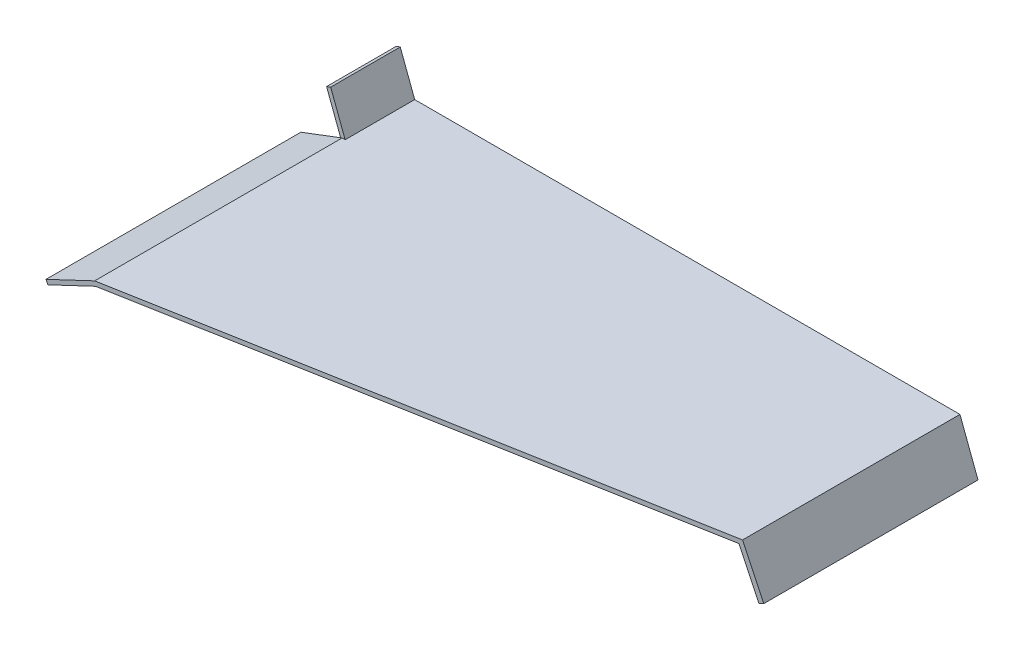
ISO-10303-21;
HEADER;
FILE_DESCRIPTION(('STEP AP214'),'2;1');
FILE_NAME('part.step','',(''),(''),'','','');
FILE_SCHEMA(('AUTOMOTIVE_DESIGN { 1 0 10303 214 1 1 1 1 }'));
ENDSEC;
DATA;
#1=APPLICATION_CONTEXT('core data for automotive mechanical design processes');
#2=APPLICATION_PROTOCOL_DEFINITION('international standard','automotive_design',2000,#1);
#3=PRODUCT_CONTEXT('',#1,'mechanical');
#4=PRODUCT('Part','Part','',(#3));
#5=PRODUCT_RELATED_PRODUCT_CATEGORY('part','',(#4));
#6=PRODUCT_DEFINITION_FORMATION('','',#4);
#7=PRODUCT_DEFINITION_CONTEXT('part definition',#1,'design');
#8=PRODUCT_DEFINITION('design','',#6,#7);
#9=PRODUCT_DEFINITION_SHAPE('','',#8);
#10=(LENGTH_UNIT() NAMED_UNIT(*) SI_UNIT(.MILLI.,.METRE.));
#11=(NAMED_UNIT(*) PLANE_ANGLE_UNIT() SI_UNIT($,.RADIAN.));
#12=(NAMED_UNIT(*) SI_UNIT($,.STERADIAN.) SOLID_ANGLE_UNIT());
#13=UNCERTAINTY_MEASURE_WITH_UNIT(LENGTH_MEASURE(1.E-05),#10,'distance_accuracy_value','');
#14=(GEOMETRIC_REPRESENTATION_CONTEXT(3) GLOBAL_UNCERTAINTY_ASSIGNED_CONTEXT((#13)) GLOBAL_UNIT_ASSIGNED_CONTEXT((#10,
#11,#12)) REPRESENTATION_CONTEXT('',''));
#15=CARTESIAN_POINT('',(0.,0.,0.));
#16=DIRECTION('',(0.,0.,1.));
#17=DIRECTION('',(1.,0.,0.));
#18=AXIS2_PLACEMENT_3D('',#15,#16,#17);
#19=CARTESIAN_POINT('',(0.,0.,0.));
#20=DIRECTION('',(0.,-1.,0.));
#21=DIRECTION('',(0.,0.,-1.));
#22=AXIS2_PLACEMENT_3D('',#19,#20,#21);
#23=PLANE('',#22);
#24=DIRECTION('',(0.,0.,-1.));
#25=VECTOR('',#24,1.);
#26=CARTESIAN_POINT('',(0.579017489366649,0.,0.));
#27=LINE('',#26,#25);
#28=CARTESIAN_POINT('',(0.579017489366639,0.,-0.105134128778656));
#29=VERTEX_POINT('',#28);
#30=CARTESIAN_POINT('',(0.579017489366646,0.,-178.435));
#31=VERTEX_POINT('',#30);
#32=EDGE_CURVE('E231',#29,#31,#27,.T.);
#33=ORIENTED_EDGE('',*,*,#32,.T.);
#34=DIRECTION('',(-1.,0.,0.));
#35=VECTOR('',#34,1.);
#36=CARTESIAN_POINT('',(0.,0.,-178.435));
#37=LINE('',#36,#35);
#38=CARTESIAN_POINT('',(0.,0.,-178.435));
#39=VERTEX_POINT('',#38);
#40=EDGE_CURVE('E225',#31,#39,#37,.T.);
#41=ORIENTED_EDGE('',*,*,#40,.T.);
#42=DIRECTION('',(0.,0.,1.));
#43=VECTOR('',#42,1.);
#44=CARTESIAN_POINT('',(0.,0.,0.));
#45=LINE('',#44,#43);
#46=CARTESIAN_POINT('',(0.,0.,-228.6));
#47=VERTEX_POINT('',#46);
#48=EDGE_CURVE('E206',#47,#39,#45,.T.);
#49=ORIENTED_EDGE('',*,*,#48,.F.);
#50=DIRECTION('',(-1.,0.,0.));
#51=VECTOR('',#50,1.);
#52=CARTESIAN_POINT('',(0.,0.,-228.6));
#53=LINE('',#52,#51);
#54=CARTESIAN_POINT('',(393.214348332455,0.,-228.6));
#55=VERTEX_POINT('',#54);
#56=EDGE_CURVE('E49',#55,#47,#53,.T.);
#57=ORIENTED_EDGE('',*,*,#56,.F.);
#58=DIRECTION('',(0.,0.,-1.));
#59=VECTOR('',#58,1.);
#60=CARTESIAN_POINT('',(393.214348332455,0.,0.));
#61=LINE('',#60,#59);
#62=CARTESIAN_POINT('',(393.214348332455,0.,-71.3972353070407));
#63=VERTEX_POINT('',#62);
#64=EDGE_CURVE('E197',#63,#55,#61,.T.);
#65=ORIENTED_EDGE('',*,*,#64,.F.);
#66=DIRECTION('',(-0.983912284561168,0.,0.178652221619614));
#67=VECTOR('',#66,1.);
#68=CARTESIAN_POINT('',(0.,0.,0.));
#69=LINE('',#68,#67);
#70=EDGE_CURVE('E202',#63,#29,#69,.T.);
#71=ORIENTED_EDGE('',*,*,#70,.T.);
#72=EDGE_LOOP('',(#33,#41,#49,#57,#65,#71));
#73=FACE_BOUND('',#72,.T.);
#74=ADVANCED_FACE('F45',(#73),#23,.T.);
#75=CARTESIAN_POINT('',(0.,0.,-178.435));
#76=DIRECTION('',(0.,0.,-1.));
#77=DIRECTION('',(-1.,0.,0.));
#78=AXIS2_PLACEMENT_3D('',#75,#76,#77);
#79=PLANE('',#78);
#80=DIRECTION('',(-0.935625016470171,-0.352995507839961,0.));
#81=VECTOR('',#80,1.);
#82=CARTESIAN_POINT('',(0.,3.175,-178.435));
#83=LINE('',#82,#81);
#84=CARTESIAN_POINT('',(0.,3.175,-178.435));
#85=VERTEX_POINT('',#84);
#86=CARTESIAN_POINT('',(-1.04861178338139,2.77937649433727,-178.435));
#87=VERTEX_POINT('',#86);
#88=EDGE_CURVE('E63',#85,#87,#83,.T.);
#89=ORIENTED_EDGE('',*,*,#88,.F.);
#90=DIRECTION('',(1.,0.,0.));
#91=VECTOR('',#90,1.);
#92=CARTESIAN_POINT('',(0.,3.175,-178.435));
#93=LINE('',#92,#91);
#94=CARTESIAN_POINT('',(2.19557966754478,3.175,-178.435));
#95=VERTEX_POINT('',#94);
#96=EDGE_CURVE('E149',#85,#95,#93,.T.);
#97=ORIENTED_EDGE('',*,*,#96,.T.);
#98=DIRECTION('',(0.352995507839961,-0.935625016470171,0.));
#99=VECTOR('',#98,1.);
#100=CARTESIAN_POINT('',(-8.23699794662592,30.8268550103198,-178.435));
#101=LINE('',#100,#99);
#102=CARTESIAN_POINT('',(-8.23699794662592,30.8268550103198,-178.435));
#103=VERTEX_POINT('',#102);
#104=EDGE_CURVE('E239',#103,#95,#101,.T.);
#105=ORIENTED_EDGE('',*,*,#104,.F.);
#106=DIRECTION('',(0.935625016470171,0.352995507839961,0.));
#107=VECTOR('',#106,1.);
#108=CARTESIAN_POINT('',(-11.2076073739187,29.706094272928,-178.435));
#109=LINE('',#108,#107);
#110=CARTESIAN_POINT('',(-11.2076073739187,29.706094272928,-178.435));
#111=VERTEX_POINT('',#110);
#112=EDGE_CURVE('E250',#111,#103,#109,.T.);
#113=ORIENTED_EDGE('',*,*,#112,.F.);
#114=DIRECTION('',(-0.35299550783996,0.935625016470172,0.));
#115=VECTOR('',#114,1.);
#116=CARTESIAN_POINT('',(0.,0.,-178.435));
#117=LINE('',#116,#115);
#118=EDGE_CURVE('E152',#87,#111,#117,.T.);
#119=ORIENTED_EDGE('',*,*,#118,.F.);
#120=EDGE_LOOP('',(#89,#97,#105,#113,#119));
#121=FACE_BOUND('',#120,.T.);
#122=ADVANCED_FACE('F147',(#121),#79,.F.);
#123=CARTESIAN_POINT('',(0.,3.175,-228.6));
#124=DIRECTION('',(0.,0.,1.));
#125=DIRECTION('',(1.,0.,0.));
#126=AXIS2_PLACEMENT_3D('',#123,#124,#125);
#127=PLANE('',#126);
#128=ORIENTED_EDGE('',*,*,#56,.T.);
#129=DIRECTION('',(-0.35299550783996,0.935625016470172,0.));
#130=VECTOR('',#129,1.);
#131=CARTESIAN_POINT('',(0.,0.,-228.6));
#132=LINE('',#131,#130);
#133=CARTESIAN_POINT('',(-11.2076073739187,29.706094272928,-228.6));
#134=VERTEX_POINT('',#133);
#135=EDGE_CURVE('E219',#47,#134,#132,.T.);
#136=ORIENTED_EDGE('',*,*,#135,.T.);
#137=DIRECTION('',(0.935625016470171,0.352995507839961,0.));
#138=VECTOR('',#137,1.);
#139=CARTESIAN_POINT('',(-11.2076073739187,29.706094272928,-228.6));
#140=LINE('',#139,#138);
#141=CARTESIAN_POINT('',(-8.23699794662592,30.8268550103198,-228.6));
#142=VERTEX_POINT('',#141);
#143=EDGE_CURVE('E230',#134,#142,#140,.T.);
#144=ORIENTED_EDGE('',*,*,#143,.T.);
#145=DIRECTION('',(0.352995507839961,-0.935625016470171,0.));
#146=VECTOR('',#145,1.);
#147=CARTESIAN_POINT('',(-8.23699794662592,30.8268550103198,-228.6));
#148=LINE('',#147,#146);
#149=CARTESIAN_POINT('',(2.19557966754478,3.175,-228.6));
#150=VERTEX_POINT('',#149);
#151=EDGE_CURVE('E235',#142,#150,#148,.T.);
#152=ORIENTED_EDGE('',*,*,#151,.T.);
#153=DIRECTION('',(-1.,0.,0.));
#154=VECTOR('',#153,1.);
#155=CARTESIAN_POINT('',(0.,3.175,-228.6));
#156=LINE('',#155,#154);
#157=CARTESIAN_POINT('',(395.409928,3.175,-228.6));
#158=VERTEX_POINT('',#157);
#159=EDGE_CURVE('E11',#158,#150,#156,.T.);
#160=ORIENTED_EDGE('',*,*,#159,.F.);
#161=DIRECTION('',(0.352995507839953,-0.935625016470174,0.));
#162=VECTOR('',#161,1.);
#163=CARTESIAN_POINT('',(395.409928,3.175,-228.6));
#164=LINE('',#163,#162);
#165=CARTESIAN_POINT('',(408.410752553745,-31.2840693565965,-228.6));
#166=VERTEX_POINT('',#165);
#167=EDGE_CURVE('E164',#158,#166,#164,.T.);
#168=ORIENTED_EDGE('',*,*,#167,.T.);
#169=DIRECTION('',(-0.935625016470174,-0.352995507839954,0.));
#170=VECTOR('',#169,1.);
#171=CARTESIAN_POINT('',(408.410752553745,-31.2840693565965,-228.6));
#172=LINE('',#171,#170);
#173=CARTESIAN_POINT('',(405.440143126453,-32.4048300939884,-228.6));
#174=VERTEX_POINT('',#173);
#175=EDGE_CURVE('E181',#166,#174,#172,.T.);
#176=ORIENTED_EDGE('',*,*,#175,.T.);
#177=DIRECTION('',(-0.352995507839955,0.935625016470173,0.));
#178=VECTOR('',#177,1.);
#179=CARTESIAN_POINT('',(405.440143126453,-32.4048300939884,-228.6));
#180=LINE('',#179,#178);
#181=EDGE_CURVE('E185',#174,#55,#180,.T.);
#182=ORIENTED_EDGE('',*,*,#181,.T.);
#183=EDGE_LOOP('',(#128,#136,#144,#152,#160,#168,#176,#182));
#184=FACE_BOUND('',#183,.T.);
#185=ADVANCED_FACE('F47',(#184),#127,.F.);
#186=CARTESIAN_POINT('',(0.,3.175,0.));
#187=DIRECTION('',(0.,-1.,0.));
#188=DIRECTION('',(0.,0.,-1.));
#189=AXIS2_PLACEMENT_3D('',#186,#187,#188);
#190=PLANE('',#189);
#191=DIRECTION('',(0.,0.,1.));
#192=VECTOR('',#191,1.);
#193=CARTESIAN_POINT('',(2.19557966754478,3.175,0.));
#194=LINE('',#193,#192);
#195=EDGE_CURVE('E70',#150,#95,#194,.T.);
#196=ORIENTED_EDGE('',*,*,#195,.T.);
#197=ORIENTED_EDGE('',*,*,#96,.F.);
#198=DIRECTION('',(0.,0.,1.));
#199=VECTOR('',#198,1.);
#200=CARTESIAN_POINT('',(0.,3.175,0.));
#201=LINE('',#200,#199);
#202=CARTESIAN_POINT('',(0.,3.175,0.));
#203=VERTEX_POINT('',#202);
#204=EDGE_CURVE('E139',#85,#203,#201,.T.);
#205=ORIENTED_EDGE('',*,*,#204,.T.);
#206=DIRECTION('',(-0.983912284561168,0.,0.178652221619614));
#207=VECTOR('',#206,1.);
#208=CARTESIAN_POINT('',(0.,3.175,0.));
#209=LINE('',#208,#207);
#210=CARTESIAN_POINT('',(395.409928,3.175,-71.795894));
#211=VERTEX_POINT('',#210);
#212=EDGE_CURVE('E201',#211,#203,#209,.T.);
#213=ORIENTED_EDGE('',*,*,#212,.F.);
#214=DIRECTION('',(0.,0.,-1.));
#215=VECTOR('',#214,1.);
#216=CARTESIAN_POINT('',(395.409928,3.175,0.));
#217=LINE('',#216,#215);
#218=EDGE_CURVE('E55',#211,#158,#217,.T.);
#219=ORIENTED_EDGE('',*,*,#218,.T.);
#220=ORIENTED_EDGE('',*,*,#159,.T.);
#221=EDGE_LOOP('',(#196,#197,#205,#213,#219,#220));
#222=FACE_BOUND('',#221,.T.);
#223=ADVANCED_FACE('F158',(#222),#190,.F.);
#224=CARTESIAN_POINT('',(0.,0.,0.));
#225=DIRECTION('',(-0.178652221619614,0.,-0.983912284561168));
#226=DIRECTION('',(-0.983912284561168,0.,0.178652221619614));
#227=AXIS2_PLACEMENT_3D('',#224,#225,#226);
#228=PLANE('',#227);
#229=ORIENTED_EDGE('',*,*,#212,.T.);
#230=DIRECTION('',(0.92240898335451,0.348009321879593,-0.167484862933356));
#231=VECTOR('',#230,1.);
#232=CARTESIAN_POINT('',(-6.70998120586161,0.643437481186961,1.21835357507268));
#233=LINE('',#232,#231);
#234=CARTESIAN_POINT('',(-29.7060942729279,-8.03260737391878,5.39383420735239));
#235=VERTEX_POINT('',#234);
#236=EDGE_CURVE('E142',#235,#203,#233,.T.);
#237=ORIENTED_EDGE('',*,*,#236,.F.);
#238=DIRECTION('',(-0.352272661424866,0.933709090703393,0.0639633172254531));
#239=VECTOR('',#238,1.);
#240=CARTESIAN_POINT('',(-30.5632182260714,-5.76077502771115,5.54946505050296));
#241=LINE('',#240,#239);
#242=CARTESIAN_POINT('',(-28.5853335355361,-11.0032168012116,5.1903339576036));
#243=VERTEX_POINT('',#242);
#244=EDGE_CURVE('E305',#243,#235,#241,.T.);
#245=ORIENTED_EDGE('',*,*,#244,.F.);
#246=DIRECTION('',(-0.92240898335451,-0.348009321879594,0.167484862933356));
#247=VECTOR('',#246,1.);
#248=CARTESIAN_POINT('',(-34.4934624247046,-13.2322539912219,6.26309254414339));
#249=LINE('',#248,#247);
#250=EDGE_CURVE('E315',#29,#243,#249,.T.);
#251=ORIENTED_EDGE('',*,*,#250,.F.);
#252=ORIENTED_EDGE('',*,*,#70,.F.);
#253=DIRECTION('',(0.352272661424861,-0.933709090703395,-0.0639633172254522));
#254=VECTOR('',#253,1.);
#255=CARTESIAN_POINT('',(404.528826855586,-29.9893594095111,-73.4516427540686));
#256=LINE('',#255,#254);
#257=CARTESIAN_POINT('',(405.440143126453,-32.4048300939884,-73.6171134763506));
#258=VERTEX_POINT('',#257);
#259=EDGE_CURVE('E173',#63,#258,#256,.T.);
#260=ORIENTED_EDGE('',*,*,#259,.T.);
#261=DIRECTION('',(0.922408983354513,0.348009321879586,-0.167484862933357));
#262=VECTOR('',#261,1.);
#263=CARTESIAN_POINT('',(402.079174991303,-33.6728665752882,-73.0068513284347));
#264=LINE('',#263,#262);
#265=CARTESIAN_POINT('',(408.410752553745,-31.2840693565965,-74.1564968970858));
#266=VERTEX_POINT('',#265);
#267=EDGE_CURVE('E170',#258,#266,#264,.T.);
#268=ORIENTED_EDGE('',*,*,#267,.T.);
#269=DIRECTION('',(-0.352272661424859,0.933709090703396,0.0639633172254519));
#270=VECTOR('',#269,1.);
#271=CARTESIAN_POINT('',(394.539648407964,5.4817017555395,-71.6378744437987));
#272=LINE('',#271,#270);
#273=EDGE_CURVE('E177',#266,#211,#272,.T.);
#274=ORIENTED_EDGE('',*,*,#273,.T.);
#275=EDGE_LOOP('',(#229,#237,#245,#251,#252,#260,#268,#274));
#276=FACE_BOUND('',#275,.T.);
#277=ADVANCED_FACE('F278',(#276),#228,.F.);
#278=CARTESIAN_POINT('',(405.440143126453,-32.4048300939884,-33.1726382196238));
#279=DIRECTION('',(-0.935625016470174,-0.352995507839955,0.));
#280=DIRECTION('',(0.352995507839955,-0.935625016470174,0.));
#281=AXIS2_PLACEMENT_3D('',#278,#279,#280);
#282=PLANE('',#281);
#283=ORIENTED_EDGE('',*,*,#259,.F.);
#284=ORIENTED_EDGE('',*,*,#64,.T.);
#285=ORIENTED_EDGE('',*,*,#181,.F.);
#286=DIRECTION('',(0.,0.,-1.));
#287=VECTOR('',#286,1.);
#288=CARTESIAN_POINT('',(405.440143126453,-32.4048300939884,-33.1726382196238));
#289=LINE('',#288,#287);
#290=EDGE_CURVE('E174',#258,#174,#289,.T.);
#291=ORIENTED_EDGE('',*,*,#290,.F.);
#292=EDGE_LOOP('',(#283,#284,#285,#291));
#293=FACE_BOUND('',#292,.T.);
#294=ADVANCED_FACE('F281',(#293),#282,.T.);
#295=CARTESIAN_POINT('',(408.410752553745,-31.2840693565965,-33.1726382196238));
#296=DIRECTION('',(0.352995507839954,-0.935625016470174,0.));
#297=DIRECTION('',(0.935625016470174,0.352995507839954,0.));
#298=AXIS2_PLACEMENT_3D('',#295,#296,#297);
#299=PLANE('',#298);
#300=ORIENTED_EDGE('',*,*,#267,.F.);
#301=ORIENTED_EDGE('',*,*,#290,.T.);
#302=ORIENTED_EDGE('',*,*,#175,.F.);
#303=DIRECTION('',(0.,0.,-1.));
#304=VECTOR('',#303,1.);
#305=CARTESIAN_POINT('',(408.410752553745,-31.2840693565965,-33.1726382196238));
#306=LINE('',#305,#304);
#307=EDGE_CURVE('E189',#266,#166,#306,.T.);
#308=ORIENTED_EDGE('',*,*,#307,.F.);
#309=EDGE_LOOP('',(#300,#301,#302,#308));
#310=FACE_BOUND('',#309,.T.);
#311=ADVANCED_FACE('F285',(#310),#299,.T.);
#312=CARTESIAN_POINT('',(395.409928,3.175,-33.1726382196238));
#313=DIRECTION('',(0.935625016470174,0.352995507839953,0.));
#314=DIRECTION('',(-0.352995507839953,0.935625016470174,0.));
#315=AXIS2_PLACEMENT_3D('',#312,#313,#314);
#316=PLANE('',#315);
#317=ORIENTED_EDGE('',*,*,#273,.F.);
#318=ORIENTED_EDGE('',*,*,#307,.T.);
#319=ORIENTED_EDGE('',*,*,#167,.F.);
#320=ORIENTED_EDGE('',*,*,#218,.F.);
#321=EDGE_LOOP('',(#317,#318,#319,#320));
#322=FACE_BOUND('',#321,.T.);
#323=ADVANCED_FACE('F269',(#322),#316,.T.);
#324=CARTESIAN_POINT('',(-8.23699794662592,30.8268550103198,-178.435));
#325=DIRECTION('',(0.935625016470171,0.352995507839961,0.));
#326=DIRECTION('',(-0.352995507839961,0.935625016470171,0.));
#327=AXIS2_PLACEMENT_3D('',#324,#325,#326);
#328=PLANE('',#327);
#329=ORIENTED_EDGE('',*,*,#195,.F.);
#330=ORIENTED_EDGE('',*,*,#151,.F.);
#331=DIRECTION('',(0.,0.,-1.));
#332=VECTOR('',#331,1.);
#333=CARTESIAN_POINT('',(-8.23699794662592,30.8268550103198,-178.435));
#334=LINE('',#333,#332);
#335=EDGE_CURVE('E160',#103,#142,#334,.T.);
#336=ORIENTED_EDGE('',*,*,#335,.F.);
#337=ORIENTED_EDGE('',*,*,#104,.T.);
#338=EDGE_LOOP('',(#329,#330,#336,#337));
#339=FACE_BOUND('',#338,.T.);
#340=ADVANCED_FACE('F258',(#339),#328,.T.);
#341=CARTESIAN_POINT('',(-11.2076073739187,29.706094272928,-178.435));
#342=DIRECTION('',(-0.352995507839961,0.935625016470171,0.));
#343=DIRECTION('',(-0.935625016470171,-0.352995507839961,0.));
#344=AXIS2_PLACEMENT_3D('',#341,#342,#343);
#345=PLANE('',#344);
#346=ORIENTED_EDGE('',*,*,#143,.F.);
#347=DIRECTION('',(0.,0.,-1.));
#348=VECTOR('',#347,1.);
#349=CARTESIAN_POINT('',(-11.2076073739187,29.706094272928,-178.435));
#350=LINE('',#349,#348);
#351=EDGE_CURVE('E166',#111,#134,#350,.T.);
#352=ORIENTED_EDGE('',*,*,#351,.F.);
#353=ORIENTED_EDGE('',*,*,#112,.T.);
#354=ORIENTED_EDGE('',*,*,#335,.T.);
#355=EDGE_LOOP('',(#346,#352,#353,#354));
#356=FACE_BOUND('',#355,.T.);
#357=ADVANCED_FACE('F259',(#356),#345,.T.);
#358=CARTESIAN_POINT('',(0.,0.,-178.435));
#359=DIRECTION('',(-0.935625016470172,-0.35299550783996,0.));
#360=DIRECTION('',(0.35299550783996,-0.935625016470172,0.));
#361=AXIS2_PLACEMENT_3D('',#358,#359,#360);
#362=PLANE('',#361);
#363=ORIENTED_EDGE('',*,*,#135,.F.);
#364=ORIENTED_EDGE('',*,*,#48,.T.);
#365=EDGE_CURVE('E247',#39,#87,#117,.T.);
#366=ORIENTED_EDGE('',*,*,#365,.T.);
#367=ORIENTED_EDGE('',*,*,#118,.T.);
#368=ORIENTED_EDGE('',*,*,#351,.T.);
#369=EDGE_LOOP('',(#363,#364,#366,#367,#368));
#370=FACE_BOUND('',#369,.T.);
#371=ADVANCED_FACE('F226',(#370),#362,.T.);
#372=CARTESIAN_POINT('',(0.,0.,-178.435));
#373=DIRECTION('',(0.,0.,1.));
#374=DIRECTION('',(1.,0.,0.));
#375=AXIS2_PLACEMENT_3D('',#372,#373,#374);
#376=PLANE('',#375);
#377=ORIENTED_EDGE('',*,*,#40,.F.);
#378=DIRECTION('',(0.935625016470171,0.352995507839962,0.));
#379=VECTOR('',#378,1.);
#380=CARTESIAN_POINT('',(-28.5853335355361,-11.0032168012116,-178.435));
#381=LINE('',#380,#379);
#382=CARTESIAN_POINT('',(-28.5853335355361,-11.0032168012116,-178.435));
#383=VERTEX_POINT('',#382);
#384=EDGE_CURVE('E326',#383,#31,#381,.T.);
#385=ORIENTED_EDGE('',*,*,#384,.F.);
#386=DIRECTION('',(0.35299550783996,-0.935625016470172,0.));
#387=VECTOR('',#386,1.);
#388=CARTESIAN_POINT('',(-29.7060942729279,-8.03260737391878,-178.435));
#389=LINE('',#388,#387);
#390=CARTESIAN_POINT('',(-29.7060942729279,-8.03260737391878,-178.435));
#391=VERTEX_POINT('',#390);
#392=EDGE_CURVE('E155',#391,#383,#389,.T.);
#393=ORIENTED_EDGE('',*,*,#392,.F.);
#394=EDGE_CURVE('E156',#87,#391,#83,.T.);
#395=ORIENTED_EDGE('',*,*,#394,.F.);
#396=ORIENTED_EDGE('',*,*,#365,.F.);
#397=EDGE_LOOP('',(#377,#385,#393,#395,#396));
#398=FACE_BOUND('',#397,.T.);
#399=ADVANCED_FACE('F267',(#398),#376,.F.);
#400=CARTESIAN_POINT('',(-28.5853335355361,-11.0032168012116,43.4332389925565));
#401=DIRECTION('',(-0.352995507839962,0.935625016470171,0.));
#402=DIRECTION('',(-0.935625016470171,-0.352995507839962,0.));
#403=AXIS2_PLACEMENT_3D('',#400,#401,#402);
#404=PLANE('',#403);
#405=ORIENTED_EDGE('',*,*,#32,.F.);
#406=ORIENTED_EDGE('',*,*,#250,.T.);
#407=DIRECTION('',(0.,0.,-1.));
#408=VECTOR('',#407,1.);
#409=CARTESIAN_POINT('',(-28.5853335355361,-11.0032168012116,43.4332389925565));
#410=LINE('',#409,#408);
#411=EDGE_CURVE('E316',#243,#383,#410,.T.);
#412=ORIENTED_EDGE('',*,*,#411,.T.);
#413=ORIENTED_EDGE('',*,*,#384,.T.);
#414=EDGE_LOOP('',(#405,#406,#412,#413));
#415=FACE_BOUND('',#414,.T.);
#416=ADVANCED_FACE('F333',(#415),#404,.F.);
#417=CARTESIAN_POINT('',(-29.7060942729279,-8.03260737391878,43.4332389925565));
#418=DIRECTION('',(0.935625016470172,0.35299550783996,0.));
#419=DIRECTION('',(-0.35299550783996,0.935625016470172,0.));
#420=AXIS2_PLACEMENT_3D('',#417,#418,#419);
#421=PLANE('',#420);
#422=ORIENTED_EDGE('',*,*,#411,.F.);
#423=ORIENTED_EDGE('',*,*,#244,.T.);
#424=DIRECTION('',(0.,0.,-1.));
#425=VECTOR('',#424,1.);
#426=CARTESIAN_POINT('',(-29.7060942729279,-8.03260737391878,43.4332389925565));
#427=LINE('',#426,#425);
#428=EDGE_CURVE('E310',#235,#391,#427,.T.);
#429=ORIENTED_EDGE('',*,*,#428,.T.);
#430=ORIENTED_EDGE('',*,*,#392,.T.);
#431=EDGE_LOOP('',(#422,#423,#429,#430));
#432=FACE_BOUND('',#431,.T.);
#433=ADVANCED_FACE('F318',(#432),#421,.F.);
#434=CARTESIAN_POINT('',(0.,3.175,43.4332389925565));
#435=DIRECTION('',(0.352995507839961,-0.935625016470171,0.));
#436=DIRECTION('',(0.935625016470171,0.352995507839961,0.));
#437=AXIS2_PLACEMENT_3D('',#434,#435,#436);
#438=PLANE('',#437);
#439=ORIENTED_EDGE('',*,*,#428,.F.);
#440=ORIENTED_EDGE('',*,*,#236,.T.);
#441=ORIENTED_EDGE('',*,*,#204,.F.);
#442=ORIENTED_EDGE('',*,*,#88,.T.);
#443=ORIENTED_EDGE('',*,*,#394,.T.);
#444=EDGE_LOOP('',(#439,#440,#441,#442,#443));
#445=FACE_BOUND('',#444,.T.);
#446=ADVANCED_FACE('F141',(#445),#438,.F.);
#447=CLOSED_SHELL('',(#74,#122,#185,#223,#277,#294,#311,#323,#340,#357,#371,#399,#416,#433,#446));
#448=MANIFOLD_SOLID_BREP('B2',#447);
#449=ADVANCED_BREP_SHAPE_REPRESENTATION('',(#18,#448),#14);
#450=SHAPE_DEFINITION_REPRESENTATION(#9,#449);
ENDSEC;
END-ISO-10303-21;
